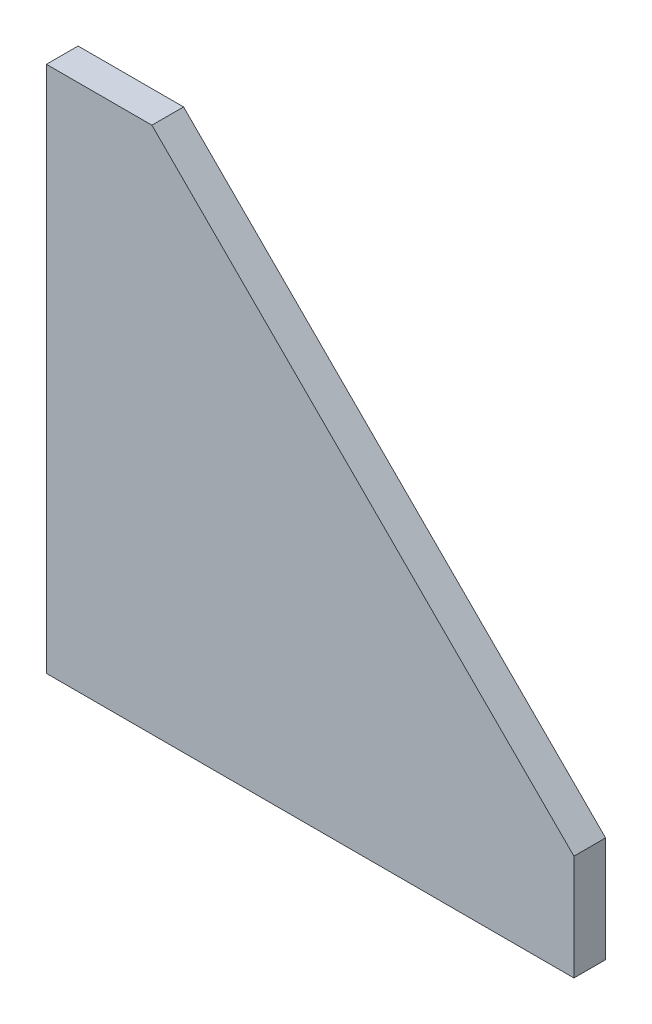
ISO-10303-21;
HEADER;
FILE_DESCRIPTION(('STEP AP214'),'2;1');
FILE_NAME('part.step','',(''),(''),'','','');
FILE_SCHEMA(('AUTOMOTIVE_DESIGN { 1 0 10303 214 1 1 1 1 }'));
ENDSEC;
DATA;
#1=APPLICATION_CONTEXT('core data for automotive mechanical design processes');
#2=APPLICATION_PROTOCOL_DEFINITION('international standard','automotive_design',2000,#1);
#3=PRODUCT_CONTEXT('',#1,'mechanical');
#4=PRODUCT('Part','Part','',(#3));
#5=PRODUCT_RELATED_PRODUCT_CATEGORY('part','',(#4));
#6=PRODUCT_DEFINITION_FORMATION('','',#4);
#7=PRODUCT_DEFINITION_CONTEXT('part definition',#1,'design');
#8=PRODUCT_DEFINITION('design','',#6,#7);
#9=PRODUCT_DEFINITION_SHAPE('','',#8);
#10=(LENGTH_UNIT() NAMED_UNIT(*) SI_UNIT(.MILLI.,.METRE.));
#11=(NAMED_UNIT(*) PLANE_ANGLE_UNIT() SI_UNIT($,.RADIAN.));
#12=(NAMED_UNIT(*) SI_UNIT($,.STERADIAN.) SOLID_ANGLE_UNIT());
#13=UNCERTAINTY_MEASURE_WITH_UNIT(LENGTH_MEASURE(1.E-05),#10,'distance_accuracy_value','');
#14=(GEOMETRIC_REPRESENTATION_CONTEXT(3) GLOBAL_UNCERTAINTY_ASSIGNED_CONTEXT((#13)) GLOBAL_UNIT_ASSIGNED_CONTEXT((#10,
#11,#12)) REPRESENTATION_CONTEXT('',''));
#15=CARTESIAN_POINT('',(0.,0.,0.));
#16=DIRECTION('',(0.,0.,1.));
#17=DIRECTION('',(1.,0.,0.));
#18=AXIS2_PLACEMENT_3D('',#15,#16,#17);
#19=CARTESIAN_POINT('',(50.,0.,3.));
#20=DIRECTION('',(0.,1.,0.));
#21=DIRECTION('',(0.,0.,1.));
#22=AXIS2_PLACEMENT_3D('',#19,#20,#21);
#23=PLANE('',#22);
#24=DIRECTION('',(1.,0.,0.));
#25=VECTOR('',#24,1.);
#26=CARTESIAN_POINT('',(50.,0.,0.));
#27=LINE('',#26,#25);
#28=CARTESIAN_POINT('',(0.,0.,0.));
#29=VERTEX_POINT('',#28);
#30=CARTESIAN_POINT('',(50.,0.,0.));
#31=VERTEX_POINT('',#30);
#32=EDGE_CURVE('E113',#29,#31,#27,.T.);
#33=ORIENTED_EDGE('',*,*,#32,.T.);
#34=DIRECTION('',(0.,0.,-1.));
#35=VECTOR('',#34,1.);
#36=CARTESIAN_POINT('',(50.,0.,3.));
#37=LINE('',#36,#35);
#38=CARTESIAN_POINT('',(50.,0.,3.));
#39=VERTEX_POINT('',#38);
#40=EDGE_CURVE('E11',#39,#31,#37,.T.);
#41=ORIENTED_EDGE('',*,*,#40,.F.);
#42=DIRECTION('',(1.,0.,0.));
#43=VECTOR('',#42,1.);
#44=CARTESIAN_POINT('',(50.,0.,3.));
#45=LINE('',#44,#43);
#46=CARTESIAN_POINT('',(0.,0.,3.));
#47=VERTEX_POINT('',#46);
#48=EDGE_CURVE('E121',#47,#39,#45,.T.);
#49=ORIENTED_EDGE('',*,*,#48,.F.);
#50=DIRECTION('',(0.,0.,-1.));
#51=VECTOR('',#50,1.);
#52=CARTESIAN_POINT('',(0.,0.,3.));
#53=LINE('',#52,#51);
#54=EDGE_CURVE('E109',#47,#29,#53,.T.);
#55=ORIENTED_EDGE('',*,*,#54,.T.);
#56=EDGE_LOOP('',(#33,#41,#49,#55));
#57=FACE_BOUND('',#56,.T.);
#58=ADVANCED_FACE('F39',(#57),#23,.F.);
#59=CARTESIAN_POINT('',(50.,10.,3.));
#60=DIRECTION('',(-1.,0.,0.));
#61=DIRECTION('',(0.,-1.,0.));
#62=AXIS2_PLACEMENT_3D('',#59,#60,#61);
#63=PLANE('',#62);
#64=DIRECTION('',(0.,1.,0.));
#65=VECTOR('',#64,1.);
#66=CARTESIAN_POINT('',(50.,10.,0.));
#67=LINE('',#66,#65);
#68=CARTESIAN_POINT('',(50.,10.,0.));
#69=VERTEX_POINT('',#68);
#70=EDGE_CURVE('E116',#31,#69,#67,.T.);
#71=ORIENTED_EDGE('',*,*,#70,.T.);
#72=DIRECTION('',(0.,0.,-1.));
#73=VECTOR('',#72,1.);
#74=CARTESIAN_POINT('',(50.,10.,3.));
#75=LINE('',#74,#73);
#76=CARTESIAN_POINT('',(50.,10.,3.));
#77=VERTEX_POINT('',#76);
#78=EDGE_CURVE('E47',#77,#69,#75,.T.);
#79=ORIENTED_EDGE('',*,*,#78,.F.);
#80=DIRECTION('',(0.,1.,0.));
#81=VECTOR('',#80,1.);
#82=CARTESIAN_POINT('',(50.,10.,3.));
#83=LINE('',#82,#81);
#84=EDGE_CURVE('E89',#39,#77,#83,.T.);
#85=ORIENTED_EDGE('',*,*,#84,.F.);
#86=ORIENTED_EDGE('',*,*,#40,.T.);
#87=EDGE_LOOP('',(#71,#79,#85,#86));
#88=FACE_BOUND('',#87,.T.);
#89=ADVANCED_FACE('F140',(#88),#63,.F.);
#90=CARTESIAN_POINT('',(10.,50.,3.));
#91=DIRECTION('',(-0.707106781186547,-0.707106781186548,0.));
#92=DIRECTION('',(0.707106781186548,-0.707106781186547,0.));
#93=AXIS2_PLACEMENT_3D('',#90,#91,#92);
#94=PLANE('',#93);
#95=DIRECTION('',(-0.707106781186548,0.707106781186547,0.));
#96=VECTOR('',#95,1.);
#97=CARTESIAN_POINT('',(10.,50.,0.));
#98=LINE('',#97,#96);
#99=CARTESIAN_POINT('',(10.,50.,0.));
#100=VERTEX_POINT('',#99);
#101=EDGE_CURVE('E104',#69,#100,#98,.T.);
#102=ORIENTED_EDGE('',*,*,#101,.T.);
#103=DIRECTION('',(0.,0.,-1.));
#104=VECTOR('',#103,1.);
#105=CARTESIAN_POINT('',(10.,50.,3.));
#106=LINE('',#105,#104);
#107=CARTESIAN_POINT('',(10.,50.,3.));
#108=VERTEX_POINT('',#107);
#109=EDGE_CURVE('E101',#108,#100,#106,.T.);
#110=ORIENTED_EDGE('',*,*,#109,.F.);
#111=DIRECTION('',(-0.707106781186548,0.707106781186547,0.));
#112=VECTOR('',#111,1.);
#113=CARTESIAN_POINT('',(10.,50.,3.));
#114=LINE('',#113,#112);
#115=EDGE_CURVE('E93',#77,#108,#114,.T.);
#116=ORIENTED_EDGE('',*,*,#115,.F.);
#117=ORIENTED_EDGE('',*,*,#78,.T.);
#118=EDGE_LOOP('',(#102,#110,#116,#117));
#119=FACE_BOUND('',#118,.T.);
#120=ADVANCED_FACE('F102',(#119),#94,.F.);
#121=CARTESIAN_POINT('',(0.,50.,3.));
#122=DIRECTION('',(0.,-1.,0.));
#123=DIRECTION('',(0.,0.,-1.));
#124=AXIS2_PLACEMENT_3D('',#121,#122,#123);
#125=PLANE('',#124);
#126=DIRECTION('',(-1.,0.,0.));
#127=VECTOR('',#126,1.);
#128=CARTESIAN_POINT('',(0.,50.,0.));
#129=LINE('',#128,#127);
#130=CARTESIAN_POINT('',(0.,50.,0.));
#131=VERTEX_POINT('',#130);
#132=EDGE_CURVE('E75',#100,#131,#129,.T.);
#133=ORIENTED_EDGE('',*,*,#132,.T.);
#134=DIRECTION('',(0.,0.,-1.));
#135=VECTOR('',#134,1.);
#136=CARTESIAN_POINT('',(0.,50.,3.));
#137=LINE('',#136,#135);
#138=CARTESIAN_POINT('',(0.,50.,3.));
#139=VERTEX_POINT('',#138);
#140=EDGE_CURVE('E105',#139,#131,#137,.T.);
#141=ORIENTED_EDGE('',*,*,#140,.F.);
#142=DIRECTION('',(-1.,0.,0.));
#143=VECTOR('',#142,1.);
#144=CARTESIAN_POINT('',(0.,50.,3.));
#145=LINE('',#144,#143);
#146=EDGE_CURVE('E97',#108,#139,#145,.T.);
#147=ORIENTED_EDGE('',*,*,#146,.F.);
#148=ORIENTED_EDGE('',*,*,#109,.T.);
#149=EDGE_LOOP('',(#133,#141,#147,#148));
#150=FACE_BOUND('',#149,.T.);
#151=ADVANCED_FACE('F107',(#150),#125,.F.);
#152=CARTESIAN_POINT('',(0.,0.,3.));
#153=DIRECTION('',(1.,0.,0.));
#154=DIRECTION('',(0.,0.,-1.));
#155=AXIS2_PLACEMENT_3D('',#152,#153,#154);
#156=PLANE('',#155);
#157=DIRECTION('',(0.,-1.,0.));
#158=VECTOR('',#157,1.);
#159=CARTESIAN_POINT('',(0.,0.,0.));
#160=LINE('',#159,#158);
#161=EDGE_CURVE('E81',#131,#29,#160,.T.);
#162=ORIENTED_EDGE('',*,*,#161,.T.);
#163=ORIENTED_EDGE('',*,*,#54,.F.);
#164=DIRECTION('',(0.,-1.,0.));
#165=VECTOR('',#164,1.);
#166=CARTESIAN_POINT('',(0.,0.,3.));
#167=LINE('',#166,#165);
#168=EDGE_CURVE('E55',#139,#47,#167,.T.);
#169=ORIENTED_EDGE('',*,*,#168,.F.);
#170=ORIENTED_EDGE('',*,*,#140,.T.);
#171=EDGE_LOOP('',(#162,#163,#169,#170));
#172=FACE_BOUND('',#171,.T.);
#173=ADVANCED_FACE('F129',(#172),#156,.F.);
#174=CARTESIAN_POINT('',(0.,0.,3.));
#175=DIRECTION('',(0.,0.,-1.));
#176=DIRECTION('',(-1.,0.,0.));
#177=AXIS2_PLACEMENT_3D('',#174,#175,#176);
#178=PLANE('',#177);
#179=ORIENTED_EDGE('',*,*,#48,.T.);
#180=ORIENTED_EDGE('',*,*,#84,.T.);
#181=ORIENTED_EDGE('',*,*,#115,.T.);
#182=ORIENTED_EDGE('',*,*,#146,.T.);
#183=ORIENTED_EDGE('',*,*,#168,.T.);
#184=EDGE_LOOP('',(#179,#180,#181,#182,#183));
#185=FACE_BOUND('',#184,.T.);
#186=ADVANCED_FACE('F95',(#185),#178,.F.);
#187=CARTESIAN_POINT('',(0.,0.,0.));
#188=DIRECTION('',(0.,0.,-1.));
#189=DIRECTION('',(-1.,0.,0.));
#190=AXIS2_PLACEMENT_3D('',#187,#188,#189);
#191=PLANE('',#190);
#192=ORIENTED_EDGE('',*,*,#32,.F.);
#193=ORIENTED_EDGE('',*,*,#161,.F.);
#194=ORIENTED_EDGE('',*,*,#132,.F.);
#195=ORIENTED_EDGE('',*,*,#101,.F.);
#196=ORIENTED_EDGE('',*,*,#70,.F.);
#197=EDGE_LOOP('',(#192,#193,#194,#195,#196));
#198=FACE_BOUND('',#197,.T.);
#199=ADVANCED_FACE('F125',(#198),#191,.T.);
#200=CLOSED_SHELL('',(#58,#89,#120,#151,#173,#186,#199));
#201=MANIFOLD_SOLID_BREP('B2',#200);
#202=ADVANCED_BREP_SHAPE_REPRESENTATION('',(#18,#201),#14);
#203=SHAPE_DEFINITION_REPRESENTATION(#9,#202);
ENDSEC;
END-ISO-10303-21;
